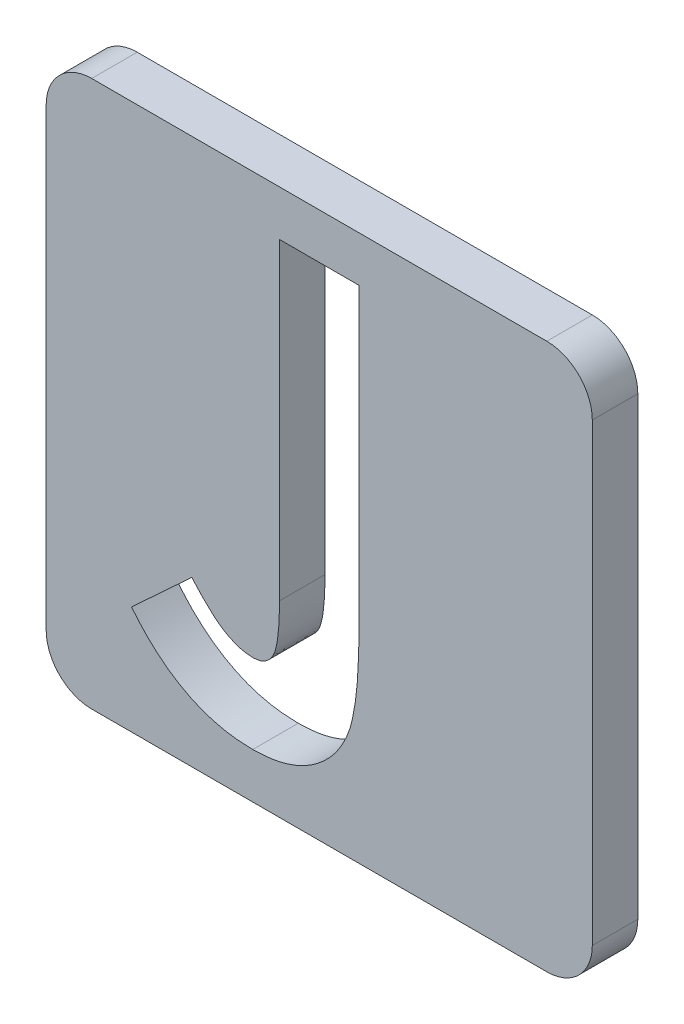
ISO-10303-21;
HEADER;
FILE_DESCRIPTION(('STEP AP214'),'2;1');
FILE_NAME('part.step','',(''),(''),'','','');
FILE_SCHEMA(('AUTOMOTIVE_DESIGN { 1 0 10303 214 1 1 1 1 }'));
ENDSEC;
DATA;
#1=APPLICATION_CONTEXT('core data for automotive mechanical design processes');
#2=APPLICATION_PROTOCOL_DEFINITION('international standard','automotive_design',2000,#1);
#3=PRODUCT_CONTEXT('',#1,'mechanical');
#4=PRODUCT('Part','Part','',(#3));
#5=PRODUCT_RELATED_PRODUCT_CATEGORY('part','',(#4));
#6=PRODUCT_DEFINITION_FORMATION('','',#4);
#7=PRODUCT_DEFINITION_CONTEXT('part definition',#1,'design');
#8=PRODUCT_DEFINITION('design','',#6,#7);
#9=PRODUCT_DEFINITION_SHAPE('','',#8);
#10=(LENGTH_UNIT() NAMED_UNIT(*) SI_UNIT(.MILLI.,.METRE.));
#11=(NAMED_UNIT(*) PLANE_ANGLE_UNIT() SI_UNIT($,.RADIAN.));
#12=(NAMED_UNIT(*) SI_UNIT($,.STERADIAN.) SOLID_ANGLE_UNIT());
#13=UNCERTAINTY_MEASURE_WITH_UNIT(LENGTH_MEASURE(1.E-05),#10,'distance_accuracy_value','');
#14=(GEOMETRIC_REPRESENTATION_CONTEXT(3) GLOBAL_UNCERTAINTY_ASSIGNED_CONTEXT((#13)) GLOBAL_UNIT_ASSIGNED_CONTEXT((#10,
#11,#12)) REPRESENTATION_CONTEXT('',''));
#15=CARTESIAN_POINT('',(0.,0.,0.));
#16=DIRECTION('',(0.,0.,1.));
#17=DIRECTION('',(1.,0.,0.));
#18=AXIS2_PLACEMENT_3D('',#15,#16,#17);
#19=CARTESIAN_POINT('',(50.,50.,10.));
#20=DIRECTION('',(0.,0.,-1.));
#21=DIRECTION('',(-1.,0.,0.));
#22=AXIS2_PLACEMENT_3D('',#19,#20,#21);
#23=PLANE('',#22);
#24=DIRECTION('',(1.,0.,0.));
#25=VECTOR('',#24,1.);
#26=CARTESIAN_POINT('',(-49.9999999999999,60.,10.));
#27=LINE('',#26,#25);
#28=CARTESIAN_POINT('',(-49.9999999999999,60.,10.));
#29=VERTEX_POINT('',#28);
#30=CARTESIAN_POINT('',(49.9999999999999,60.,10.));
#31=VERTEX_POINT('',#30);
#32=EDGE_CURVE('E267',#29,#31,#27,.T.);
#33=ORIENTED_EDGE('',*,*,#32,.F.);
#34=CARTESIAN_POINT('',(-50.,50.,10.));
#35=DIRECTION('',(0.,0.,1.));
#36=DIRECTION('',(1.,0.,0.));
#37=AXIS2_PLACEMENT_3D('',#34,#35,#36);
#38=CIRCLE('',#37,10.);
#39=CARTESIAN_POINT('',(-60.,49.9999999999999,10.));
#40=VERTEX_POINT('',#39);
#41=EDGE_CURVE('E254',#29,#40,#38,.T.);
#42=ORIENTED_EDGE('',*,*,#41,.T.);
#43=DIRECTION('',(0.,-1.,0.));
#44=VECTOR('',#43,1.);
#45=CARTESIAN_POINT('',(-60.,49.9999999999999,10.));
#46=LINE('',#45,#44);
#47=CARTESIAN_POINT('',(-60.,-49.9999999999999,10.));
#48=VERTEX_POINT('',#47);
#49=EDGE_CURVE('E282',#40,#48,#46,.T.);
#50=ORIENTED_EDGE('',*,*,#49,.T.);
#51=CARTESIAN_POINT('',(-50.,-50.,10.));
#52=DIRECTION('',(0.,0.,1.));
#53=DIRECTION('',(1.,0.,0.));
#54=AXIS2_PLACEMENT_3D('',#51,#52,#53);
#55=CIRCLE('',#54,10.);
#56=CARTESIAN_POINT('',(-49.9999999999999,-60.,10.));
#57=VERTEX_POINT('',#56);
#58=EDGE_CURVE('E286',#48,#57,#55,.T.);
#59=ORIENTED_EDGE('',*,*,#58,.T.);
#60=DIRECTION('',(1.,0.,0.));
#61=VECTOR('',#60,1.);
#62=CARTESIAN_POINT('',(-49.9999999999999,-60.,10.));
#63=LINE('',#62,#61);
#64=CARTESIAN_POINT('',(49.9999999999999,-60.,10.));
#65=VERTEX_POINT('',#64);
#66=EDGE_CURVE('E289',#57,#65,#63,.T.);
#67=ORIENTED_EDGE('',*,*,#66,.T.);
#68=CARTESIAN_POINT('',(50.,-50.,10.));
#69=DIRECTION('',(0.,0.,1.));
#70=DIRECTION('',(1.,0.,0.));
#71=AXIS2_PLACEMENT_3D('',#68,#69,#70);
#72=CIRCLE('',#71,10.);
#73=CARTESIAN_POINT('',(60.,-50.,10.));
#74=VERTEX_POINT('',#73);
#75=EDGE_CURVE('E293',#65,#74,#72,.T.);
#76=ORIENTED_EDGE('',*,*,#75,.T.);
#77=DIRECTION('',(0.,-1.,0.));
#78=VECTOR('',#77,1.);
#79=CARTESIAN_POINT('',(60.,49.9999999999999,10.));
#80=LINE('',#79,#78);
#81=CARTESIAN_POINT('',(60.,49.9999999999999,10.));
#82=VERTEX_POINT('',#81);
#83=EDGE_CURVE('E295',#82,#74,#80,.T.);
#84=ORIENTED_EDGE('',*,*,#83,.F.);
#85=CARTESIAN_POINT('',(50.,50.,10.));
#86=DIRECTION('',(0.,0.,-1.));
#87=DIRECTION('',(-1.,0.,0.));
#88=AXIS2_PLACEMENT_3D('',#85,#86,#87);
#89=CIRCLE('',#88,10.);
#90=EDGE_CURVE('E298',#31,#82,#89,.T.);
#91=ORIENTED_EDGE('',*,*,#90,.F.);
#92=EDGE_LOOP('',(#33,#42,#50,#59,#67,#76,#84,#91));
#93=FACE_BOUND('',#92,.T.);
#94=DIRECTION('',(0.,1.,0.));
#95=VECTOR('',#94,1.);
#96=CARTESIAN_POINT('',(-8.75,-18.7890625,10.));
#97=LINE('',#96,#95);
#98=CARTESIAN_POINT('',(-8.75,-18.7890625,10.));
#99=VERTEX_POINT('',#98);
#100=CARTESIAN_POINT('',(-8.75,50.,10.));
#101=VERTEX_POINT('',#100);
#102=EDGE_CURVE('E50',#99,#101,#97,.T.);
#103=ORIENTED_EDGE('',*,*,#102,.T.);
#104=DIRECTION('',(1.,0.,0.));
#105=VECTOR('',#104,1.);
#106=CARTESIAN_POINT('',(-8.75,50.,10.));
#107=LINE('',#106,#105);
#108=CARTESIAN_POINT('',(8.75,50.,10.));
#109=VERTEX_POINT('',#108);
#110=EDGE_CURVE('E162',#101,#109,#107,.T.);
#111=ORIENTED_EDGE('',*,*,#110,.T.);
#112=DIRECTION('',(0.,-1.,0.));
#113=VECTOR('',#112,1.);
#114=CARTESIAN_POINT('',(8.75,50.,10.));
#115=LINE('',#114,#113);
#116=CARTESIAN_POINT('',(8.75,-14.7265625,10.));
#117=VERTEX_POINT('',#116);
#118=EDGE_CURVE('E344',#109,#117,#115,.T.);
#119=ORIENTED_EDGE('',*,*,#118,.T.);
#120=CARTESIAN_POINT('',(8.75,-14.7265625,10.));
#121=CARTESIAN_POINT('',(8.74358397477013,-15.9636621494107,10.));
#122=CARTESIAN_POINT('',(8.73122156089561,-18.347308927923,10.));
#123=CARTESIAN_POINT('',(8.60745186955848,-21.7788803857544,10.));
#124=CARTESIAN_POINT('',(8.44009342151562,-24.9251192817215,10.));
#125=CARTESIAN_POINT('',(8.19908110918843,-27.7809843248954,10.));
#126=CARTESIAN_POINT('',(7.8411118384812,-30.346337413872,10.));
#127=CARTESIAN_POINT('',(7.43599931637115,-32.6275788685781,10.));
#128=CARTESIAN_POINT('',(6.98904775340342,-34.6340041108708,10.));
#129=CARTESIAN_POINT('',(6.23403688986838,-36.8795061070048,10.));
#130=CARTESIAN_POINT('',(5.06190440351795,-39.3661441368278,10.));
#131=CARTESIAN_POINT('',(3.29312302339564,-42.0520665799957,10.));
#132=CARTESIAN_POINT('',(1.09042405424103,-44.3856755015924,10.));
#133=CARTESIAN_POINT('',(-1.44635757385313,-46.4126845783194,10.));
#134=CARTESIAN_POINT('',(-4.33859612365525,-48.0176923341542,10.));
#135=CARTESIAN_POINT('',(-7.51966121989016,-49.1777962372361,10.));
#136=CARTESIAN_POINT('',(-10.9793837546611,-49.8708503443223,10.));
#137=CARTESIAN_POINT('',(-13.3756766533103,-49.9561068592411,10.));
#138=CARTESIAN_POINT('',(-14.609375,-50.,10.));
#139=B_SPLINE_CURVE_WITH_KNOTS('',3,(#120,#121,#122,#123,#124,#125,#126,#127,#128,#129,#130,
#131,#132,#133,#134,#135,#136,#137,#138),.UNSPECIFIED.,.F.,.F.,(4,1,1,1,1,1,1,1,1,1,1,1,1,1,1,1,
4),(0.,0.0764053506058013,0.147218025580542,0.212058993569066,0.270999490309765,
0.324170992612471,0.371969814615872,0.414105230295775,0.450981256131895,0.518077209357026,
0.583319665547195,0.64875638268336,0.715449883456707,0.783134877260214,0.852084921522458,
0.923847962045423,1.),.UNSPECIFIED.);
#140=CARTESIAN_POINT('',(-14.609375,-50.,10.));
#141=VERTEX_POINT('',#140);
#142=EDGE_CURVE('E336',#117,#141,#139,.T.);
#143=ORIENTED_EDGE('',*,*,#142,.T.);
#144=CARTESIAN_POINT('',(-14.609375,-50.,10.));
#145=CARTESIAN_POINT('',(-15.8947764125258,-49.9602054508401,10.));
#146=CARTESIAN_POINT('',(-18.4300899461713,-49.8817150601596,10.));
#147=CARTESIAN_POINT('',(-22.1483883488443,-49.2131784996106,10.));
#148=CARTESIAN_POINT('',(-25.7221379227649,-48.1413132351529,10.));
#149=CARTESIAN_POINT('',(-29.1328499701738,-46.5915247062839,9.99999999999999));
#150=CARTESIAN_POINT('',(-32.4272522812713,-44.6502051790615,10.));
#151=CARTESIAN_POINT('',(-35.5455544736893,-42.2421872629834,10.));
#152=CARTESIAN_POINT('',(-38.5528624147778,-39.4421541552723,10.));
#153=CARTESIAN_POINT('',(-40.3356129197375,-37.2934790185742,10.));
#154=CARTESIAN_POINT('',(-41.25,-36.19140625,10.));
#155=B_SPLINE_CURVE_WITH_KNOTS('',3,(#144,#145,#146,#147,#148,#149,#150,#151,#152,#153,#154),
.UNSPECIFIED.,.F.,.F.,(4,1,1,1,1,1,1,1,4),(0.,0.123873098257655,0.24432612210228,
0.363091916241499,0.482806410598963,0.604690738529227,0.731012015230361,0.862033897993613,1.),.UNSPECIFIED.);
#156=CARTESIAN_POINT('',(-41.25,-36.19140625,10.));
#157=VERTEX_POINT('',#156);
#158=EDGE_CURVE('E331',#141,#157,#155,.T.);
#159=ORIENTED_EDGE('',*,*,#158,.T.);
#160=DIRECTION('',(0.734180402826145,0.678954443321523,0.));
#161=VECTOR('',#160,1.);
#162=CARTESIAN_POINT('',(-41.25,-36.19140625,10.));
#163=LINE('',#162,#161);
#164=CARTESIAN_POINT('',(-28.0078125,-23.9453125,10.));
#165=VERTEX_POINT('',#164);
#166=EDGE_CURVE('E325',#157,#165,#163,.T.);
#167=ORIENTED_EDGE('',*,*,#166,.T.);
#168=CARTESIAN_POINT('',(-28.0078125,-23.9453125,10.));
#169=CARTESIAN_POINT('',(-27.3144665086936,-24.7292910121457,10.));
#170=CARTESIAN_POINT('',(-26.0170297603917,-26.1963255725107,10.));
#171=CARTESIAN_POINT('',(-24.0618308294355,-28.1093746690527,10.));
#172=CARTESIAN_POINT('',(-22.2981360412439,-29.646288809913,10.));
#173=CARTESIAN_POINT('',(-20.635555644691,-30.7548788195105,10.));
#174=CARTESIAN_POINT('',(-19.0666184095416,-31.5363110197004,10.));
#175=CARTESIAN_POINT('',(-17.5575675515649,-32.0991986034415,10.));
#176=CARTESIAN_POINT('',(-16.0613637854838,-32.4178249420816,10.));
#177=CARTESIAN_POINT('',(-15.0729259559888,-32.4730229237121,10.));
#178=CARTESIAN_POINT('',(-14.58984375,-32.5,10.));
#179=B_SPLINE_CURVE_WITH_KNOTS('',3,(#168,#169,#170,#171,#172,#173,#174,#175,#176,#177,#178),
.UNSPECIFIED.,.F.,.F.,(4,1,1,1,1,1,1,1,4),(0.,0.191188734676117,0.357765521601646,
0.499586074062438,0.618044672839495,0.721795541859932,0.819272160926337,0.911672337320496,1.),.UNSPECIFIED.);
#180=CARTESIAN_POINT('',(-14.58984375,-32.5,10.));
#181=VERTEX_POINT('',#180);
#182=EDGE_CURVE('E317',#165,#181,#179,.T.);
#183=ORIENTED_EDGE('',*,*,#182,.T.);
#184=CARTESIAN_POINT('',(-14.58984375,-32.5,10.));
#185=CARTESIAN_POINT('',(-14.1222739453944,-32.4756169876666,10.));
#186=CARTESIAN_POINT('',(-13.2232909253375,-32.4287364708976,10.));
#187=CARTESIAN_POINT('',(-11.9871547973749,-31.9076001044048,10.));
#188=CARTESIAN_POINT('',(-10.9450124922237,-31.0893940979087,10.));
#189=CARTESIAN_POINT('',(-10.2589275099877,-30.1487601225782,10.));
#190=CARTESIAN_POINT('',(-9.8217098019674,-29.1871789648928,10.));
#191=CARTESIAN_POINT('',(-9.54852793709075,-28.2576629543554,10.));
#192=CARTESIAN_POINT('',(-9.28927787470028,-27.1434251852839,10.));
#193=CARTESIAN_POINT('',(-9.0815725063976,-25.845024103373,10.));
#194=CARTESIAN_POINT('',(-8.92462995686318,-24.3455238406369,10.));
#195=CARTESIAN_POINT('',(-8.84640544238334,-22.6631282478337,10.));
#196=CARTESIAN_POINT('',(-8.75127439924185,-20.7887459200542,10.));
#197=CARTESIAN_POINT('',(-8.75043990603434,-19.4793271944154,10.));
#198=CARTESIAN_POINT('',(-8.75,-18.7890625,10.));
#199=B_SPLINE_CURVE_WITH_KNOTS('',3,(#184,#185,#186,#187,#188,#189,#190,#191,#192,#193,#194,
#195,#196,#197,#198),.UNSPECIFIED.,.F.,.F.,(4,1,1,1,1,1,1,1,1,1,1,1,4),(0.,0.0836606106248747,
0.160851850693831,0.236744462245999,0.319647798711959,0.367325512256431,0.426209548529817,
0.493524089529688,0.573025277738409,0.662506020502811,0.764543201859919,0.875878119325884,1.),.UNSPECIFIED.);
#200=EDGE_CURVE('E156',#181,#99,#199,.T.);
#201=ORIENTED_EDGE('',*,*,#200,.T.);
#202=EDGE_LOOP('',(#103,#111,#119,#143,#159,#167,#183,#201));
#203=FACE_BOUND('',#202,.T.);
#204=ADVANCED_FACE('F33',(#93,#203),#23,.F.);
#205=CARTESIAN_POINT('',(50.,50.,0.));
#206=DIRECTION('',(0.,0.,-1.));
#207=DIRECTION('',(-1.,0.,0.));
#208=AXIS2_PLACEMENT_3D('',#205,#206,#207);
#209=PLANE('',#208);
#210=DIRECTION('',(1.,0.,0.));
#211=VECTOR('',#210,1.);
#212=CARTESIAN_POINT('',(-49.9999999999999,60.,0.));
#213=LINE('',#212,#211);
#214=CARTESIAN_POINT('',(-49.9999999999999,60.,0.));
#215=VERTEX_POINT('',#214);
#216=CARTESIAN_POINT('',(49.9999999999999,60.,0.));
#217=VERTEX_POINT('',#216);
#218=EDGE_CURVE('E163',#215,#217,#213,.T.);
#219=ORIENTED_EDGE('',*,*,#218,.T.);
#220=CARTESIAN_POINT('',(50.,50.,0.));
#221=DIRECTION('',(0.,0.,-1.));
#222=DIRECTION('',(-1.,0.,0.));
#223=AXIS2_PLACEMENT_3D('',#220,#221,#222);
#224=CIRCLE('',#223,10.);
#225=CARTESIAN_POINT('',(60.,49.9999999999999,0.));
#226=VERTEX_POINT('',#225);
#227=EDGE_CURVE('E238',#217,#226,#224,.T.);
#228=ORIENTED_EDGE('',*,*,#227,.T.);
#229=DIRECTION('',(0.,-1.,0.));
#230=VECTOR('',#229,1.);
#231=CARTESIAN_POINT('',(60.,49.9999999999999,0.));
#232=LINE('',#231,#230);
#233=CARTESIAN_POINT('',(60.,-50.,0.));
#234=VERTEX_POINT('',#233);
#235=EDGE_CURVE('E245',#226,#234,#232,.T.);
#236=ORIENTED_EDGE('',*,*,#235,.T.);
#237=CARTESIAN_POINT('',(50.,-50.,0.));
#238=DIRECTION('',(0.,0.,1.));
#239=DIRECTION('',(1.,0.,0.));
#240=AXIS2_PLACEMENT_3D('',#237,#238,#239);
#241=CIRCLE('',#240,10.);
#242=CARTESIAN_POINT('',(49.9999999999999,-60.,0.));
#243=VERTEX_POINT('',#242);
#244=EDGE_CURVE('E258',#243,#234,#241,.T.);
#245=ORIENTED_EDGE('',*,*,#244,.F.);
#246=DIRECTION('',(1.,0.,0.));
#247=VECTOR('',#246,1.);
#248=CARTESIAN_POINT('',(-49.9999999999999,-60.,0.));
#249=LINE('',#248,#247);
#250=CARTESIAN_POINT('',(-49.9999999999999,-60.,0.));
#251=VERTEX_POINT('',#250);
#252=EDGE_CURVE('E261',#251,#243,#249,.T.);
#253=ORIENTED_EDGE('',*,*,#252,.F.);
#254=CARTESIAN_POINT('',(-50.,-50.,0.));
#255=DIRECTION('',(0.,0.,1.));
#256=DIRECTION('',(1.,0.,0.));
#257=AXIS2_PLACEMENT_3D('',#254,#255,#256);
#258=CIRCLE('',#257,10.);
#259=CARTESIAN_POINT('',(-60.,-49.9999999999999,0.));
#260=VERTEX_POINT('',#259);
#261=EDGE_CURVE('E263',#260,#251,#258,.T.);
#262=ORIENTED_EDGE('',*,*,#261,.F.);
#263=DIRECTION('',(0.,-1.,0.));
#264=VECTOR('',#263,1.);
#265=CARTESIAN_POINT('',(-60.,49.9999999999999,0.));
#266=LINE('',#265,#264);
#267=CARTESIAN_POINT('',(-60.,49.9999999999999,0.));
#268=VERTEX_POINT('',#267);
#269=EDGE_CURVE('E265',#268,#260,#266,.T.);
#270=ORIENTED_EDGE('',*,*,#269,.F.);
#271=CARTESIAN_POINT('',(-50.,50.,0.));
#272=DIRECTION('',(0.,0.,1.));
#273=DIRECTION('',(1.,0.,0.));
#274=AXIS2_PLACEMENT_3D('',#271,#272,#273);
#275=CIRCLE('',#274,10.);
#276=EDGE_CURVE('E250',#215,#268,#275,.T.);
#277=ORIENTED_EDGE('',*,*,#276,.F.);
#278=EDGE_LOOP('',(#219,#228,#236,#245,#253,#262,#270,#277));
#279=FACE_BOUND('',#278,.T.);
#280=DIRECTION('',(1.,0.,0.));
#281=VECTOR('',#280,1.);
#282=CARTESIAN_POINT('',(-8.75,50.,0.));
#283=LINE('',#282,#281);
#284=CARTESIAN_POINT('',(-8.75,50.,0.));
#285=VERTEX_POINT('',#284);
#286=CARTESIAN_POINT('',(8.75,50.,0.));
#287=VERTEX_POINT('',#286);
#288=EDGE_CURVE('E155',#285,#287,#283,.T.);
#289=ORIENTED_EDGE('',*,*,#288,.F.);
#290=DIRECTION('',(0.,1.,0.));
#291=VECTOR('',#290,1.);
#292=CARTESIAN_POINT('',(-8.75,-18.7890625,0.));
#293=LINE('',#292,#291);
#294=CARTESIAN_POINT('',(-8.75,-18.7890625,0.));
#295=VERTEX_POINT('',#294);
#296=EDGE_CURVE('E147',#295,#285,#293,.T.);
#297=ORIENTED_EDGE('',*,*,#296,.F.);
#298=CARTESIAN_POINT('',(-14.58984375,-32.5,0.));
#299=CARTESIAN_POINT('',(-14.1222739453944,-32.4756169876666,0.));
#300=CARTESIAN_POINT('',(-13.2232909253375,-32.4287364708976,0.));
#301=CARTESIAN_POINT('',(-11.9871547973749,-31.9076001044048,0.));
#302=CARTESIAN_POINT('',(-10.9450124922237,-31.0893940979087,0.));
#303=CARTESIAN_POINT('',(-10.2589275099877,-30.1487601225782,0.));
#304=CARTESIAN_POINT('',(-9.8217098019674,-29.1871789648928,0.));
#305=CARTESIAN_POINT('',(-9.54852793709075,-28.2576629543554,0.));
#306=CARTESIAN_POINT('',(-9.28927787470028,-27.1434251852839,0.));
#307=CARTESIAN_POINT('',(-9.0815725063976,-25.845024103373,0.));
#308=CARTESIAN_POINT('',(-8.92462995686318,-24.3455238406369,0.));
#309=CARTESIAN_POINT('',(-8.84640544238334,-22.6631282478337,0.));
#310=CARTESIAN_POINT('',(-8.75127439924185,-20.7887459200542,0.));
#311=CARTESIAN_POINT('',(-8.75043990603434,-19.4793271944154,0.));
#312=CARTESIAN_POINT('',(-8.75,-18.7890625,0.));
#313=B_SPLINE_CURVE_WITH_KNOTS('',3,(#298,#299,#300,#301,#302,#303,#304,#305,#306,#307,#308,
#309,#310,#311,#312),.UNSPECIFIED.,.F.,.F.,(4,1,1,1,1,1,1,1,1,1,1,1,4),(0.,0.0836606106248747,
0.160851850693831,0.236744462245999,0.319647798711959,0.367325512256431,0.426209548529817,
0.493524089529688,0.573025277738409,0.662506020502811,0.764543201859919,0.875878119325884,1.),.UNSPECIFIED.);
#314=CARTESIAN_POINT('',(-14.58984375,-32.5,0.));
#315=VERTEX_POINT('',#314);
#316=EDGE_CURVE('E312',#315,#295,#313,.T.);
#317=ORIENTED_EDGE('',*,*,#316,.F.);
#318=CARTESIAN_POINT('',(-28.0078125,-23.9453125,0.));
#319=CARTESIAN_POINT('',(-27.3144665086936,-24.7292910121457,0.));
#320=CARTESIAN_POINT('',(-26.0170297603917,-26.1963255725107,0.));
#321=CARTESIAN_POINT('',(-24.0618308294355,-28.1093746690527,0.));
#322=CARTESIAN_POINT('',(-22.2981360412439,-29.646288809913,0.));
#323=CARTESIAN_POINT('',(-20.635555644691,-30.7548788195105,0.));
#324=CARTESIAN_POINT('',(-19.0666184095416,-31.5363110197004,0.));
#325=CARTESIAN_POINT('',(-17.5575675515649,-32.0991986034415,0.));
#326=CARTESIAN_POINT('',(-16.0613637854838,-32.4178249420816,0.));
#327=CARTESIAN_POINT('',(-15.0729259559888,-32.4730229237121,0.));
#328=CARTESIAN_POINT('',(-14.58984375,-32.5,0.));
#329=B_SPLINE_CURVE_WITH_KNOTS('',3,(#318,#319,#320,#321,#322,#323,#324,#325,#326,#327,#328),
.UNSPECIFIED.,.F.,.F.,(4,1,1,1,1,1,1,1,4),(0.,0.191188734676117,0.357765521601646,
0.499586074062438,0.618044672839495,0.721795541859932,0.819272160926337,0.911672337320496,1.),.UNSPECIFIED.);
#330=CARTESIAN_POINT('',(-28.0078125,-23.9453125,0.));
#331=VERTEX_POINT('',#330);
#332=EDGE_CURVE('E356',#331,#315,#329,.T.);
#333=ORIENTED_EDGE('',*,*,#332,.F.);
#334=DIRECTION('',(0.734180402826145,0.678954443321523,0.));
#335=VECTOR('',#334,1.);
#336=CARTESIAN_POINT('',(-41.25,-36.19140625,0.));
#337=LINE('',#336,#335);
#338=CARTESIAN_POINT('',(-41.25,-36.19140625,0.));
#339=VERTEX_POINT('',#338);
#340=EDGE_CURVE('E387',#339,#331,#337,.T.);
#341=ORIENTED_EDGE('',*,*,#340,.F.);
#342=CARTESIAN_POINT('',(-14.609375,-50.,0.));
#343=CARTESIAN_POINT('',(-15.8947764125258,-49.9602054508401,0.));
#344=CARTESIAN_POINT('',(-18.4300899461713,-49.8817150601596,0.));
#345=CARTESIAN_POINT('',(-22.1483883488443,-49.2131784996106,0.));
#346=CARTESIAN_POINT('',(-25.7221379227649,-48.1413132351529,0.));
#347=CARTESIAN_POINT('',(-29.1328499701738,-46.5915247062839,0.));
#348=CARTESIAN_POINT('',(-32.4272522812713,-44.6502051790615,0.));
#349=CARTESIAN_POINT('',(-35.5455544736893,-42.2421872629834,0.));
#350=CARTESIAN_POINT('',(-38.5528624147778,-39.4421541552723,0.));
#351=CARTESIAN_POINT('',(-40.3356129197375,-37.2934790185742,0.));
#352=CARTESIAN_POINT('',(-41.25,-36.19140625,0.));
#353=B_SPLINE_CURVE_WITH_KNOTS('',3,(#342,#343,#344,#345,#346,#347,#348,#349,#350,#351,#352),
.UNSPECIFIED.,.F.,.F.,(4,1,1,1,1,1,1,1,4),(0.,0.123873098257655,0.24432612210228,
0.363091916241499,0.482806410598963,0.604690738529227,0.731012015230361,0.862033897993613,1.),.UNSPECIFIED.);
#354=CARTESIAN_POINT('',(-14.609375,-50.,0.));
#355=VERTEX_POINT('',#354);
#356=EDGE_CURVE('E178',#355,#339,#353,.T.);
#357=ORIENTED_EDGE('',*,*,#356,.F.);
#358=CARTESIAN_POINT('',(8.75,-14.7265625,0.));
#359=CARTESIAN_POINT('',(8.74358397477013,-15.9636621494107,0.));
#360=CARTESIAN_POINT('',(8.73122156089561,-18.347308927923,0.));
#361=CARTESIAN_POINT('',(8.60745186955848,-21.7788803857544,0.));
#362=CARTESIAN_POINT('',(8.44009342151562,-24.9251192817215,0.));
#363=CARTESIAN_POINT('',(8.19908110918843,-27.7809843248954,0.));
#364=CARTESIAN_POINT('',(7.8411118384812,-30.346337413872,0.));
#365=CARTESIAN_POINT('',(7.43599931637115,-32.6275788685781,0.));
#366=CARTESIAN_POINT('',(6.98904775340342,-34.6340041108708,0.));
#367=CARTESIAN_POINT('',(6.23403688986838,-36.8795061070048,0.));
#368=CARTESIAN_POINT('',(5.06190440351795,-39.3661441368278,0.));
#369=CARTESIAN_POINT('',(3.29312302339564,-42.0520665799957,0.));
#370=CARTESIAN_POINT('',(1.09042405424103,-44.3856755015924,0.));
#371=CARTESIAN_POINT('',(-1.44635757385313,-46.4126845783194,0.));
#372=CARTESIAN_POINT('',(-4.33859612365525,-48.0176923341542,0.));
#373=CARTESIAN_POINT('',(-7.51966121989016,-49.1777962372361,0.));
#374=CARTESIAN_POINT('',(-10.9793837546611,-49.8708503443223,0.));
#375=CARTESIAN_POINT('',(-13.3756766533103,-49.9561068592411,0.));
#376=CARTESIAN_POINT('',(-14.609375,-50.,0.));
#377=B_SPLINE_CURVE_WITH_KNOTS('',3,(#358,#359,#360,#361,#362,#363,#364,#365,#366,#367,#368,
#369,#370,#371,#372,#373,#374,#375,#376),.UNSPECIFIED.,.F.,.F.,(4,1,1,1,1,1,1,1,1,1,1,1,1,1,1,1,
4),(0.,0.0764053506058013,0.147218025580542,0.212058993569066,0.270999490309765,
0.324170992612471,0.371969814615872,0.414105230295775,0.450981256131895,0.518077209357026,
0.583319665547195,0.64875638268336,0.715449883456707,0.783134877260214,0.852084921522458,
0.923847962045423,1.),.UNSPECIFIED.);
#378=CARTESIAN_POINT('',(8.75,-14.7265625,0.));
#379=VERTEX_POINT('',#378);
#380=EDGE_CURVE('E171',#379,#355,#377,.T.);
#381=ORIENTED_EDGE('',*,*,#380,.F.);
#382=DIRECTION('',(0.,-1.,0.));
#383=VECTOR('',#382,1.);
#384=CARTESIAN_POINT('',(8.75,50.,0.));
#385=LINE('',#384,#383);
#386=EDGE_CURVE('E169',#287,#379,#385,.T.);
#387=ORIENTED_EDGE('',*,*,#386,.F.);
#388=EDGE_LOOP('',(#289,#297,#317,#333,#341,#357,#381,#387));
#389=FACE_BOUND('',#388,.T.);
#390=ADVANCED_FACE('F167',(#279,#389),#209,.T.);
#391=CARTESIAN_POINT('',(-49.9999999999999,60.,10.));
#392=DIRECTION('',(0.,1.,0.));
#393=DIRECTION('',(0.,0.,1.));
#394=AXIS2_PLACEMENT_3D('',#391,#392,#393);
#395=PLANE('',#394);
#396=ORIENTED_EDGE('',*,*,#218,.F.);
#397=DIRECTION('',(0.,0.,-1.));
#398=VECTOR('',#397,1.);
#399=CARTESIAN_POINT('',(-49.9999999999999,60.,10.));
#400=LINE('',#399,#398);
#401=EDGE_CURVE('E11',#29,#215,#400,.T.);
#402=ORIENTED_EDGE('',*,*,#401,.F.);
#403=ORIENTED_EDGE('',*,*,#32,.T.);
#404=DIRECTION('',(0.,0.,-1.));
#405=VECTOR('',#404,1.);
#406=CARTESIAN_POINT('',(49.9999999999999,60.,10.));
#407=LINE('',#406,#405);
#408=EDGE_CURVE('E37',#31,#217,#407,.T.);
#409=ORIENTED_EDGE('',*,*,#408,.T.);
#410=EDGE_LOOP('',(#396,#402,#403,#409));
#411=FACE_BOUND('',#410,.T.);
#412=ADVANCED_FACE('F35',(#411),#395,.T.);
#413=CARTESIAN_POINT('',(-50.,50.,10.));
#414=DIRECTION('',(0.,0.,-1.));
#415=DIRECTION('',(-1.,0.,0.));
#416=AXIS2_PLACEMENT_3D('',#413,#414,#415);
#417=CYLINDRICAL_SURFACE('',#416,10.);
#418=ORIENTED_EDGE('',*,*,#276,.T.);
#419=DIRECTION('',(0.,0.,-1.));
#420=VECTOR('',#419,1.);
#421=CARTESIAN_POINT('',(-60.,49.9999999999999,10.));
#422=LINE('',#421,#420);
#423=EDGE_CURVE('E42',#40,#268,#422,.T.);
#424=ORIENTED_EDGE('',*,*,#423,.F.);
#425=ORIENTED_EDGE('',*,*,#41,.F.);
#426=ORIENTED_EDGE('',*,*,#401,.T.);
#427=EDGE_LOOP('',(#418,#424,#425,#426));
#428=FACE_BOUND('',#427,.T.);
#429=ADVANCED_FACE('F209',(#428),#417,.T.);
#430=CARTESIAN_POINT('',(-60.,49.9999999999999,10.));
#431=DIRECTION('',(1.,0.,0.));
#432=DIRECTION('',(0.,1.,0.));
#433=AXIS2_PLACEMENT_3D('',#430,#431,#432);
#434=PLANE('',#433);
#435=ORIENTED_EDGE('',*,*,#269,.T.);
#436=DIRECTION('',(0.,0.,-1.));
#437=VECTOR('',#436,1.);
#438=CARTESIAN_POINT('',(-60.,-49.9999999999999,10.));
#439=LINE('',#438,#437);
#440=EDGE_CURVE('E271',#48,#260,#439,.T.);
#441=ORIENTED_EDGE('',*,*,#440,.F.);
#442=ORIENTED_EDGE('',*,*,#49,.F.);
#443=ORIENTED_EDGE('',*,*,#423,.T.);
#444=EDGE_LOOP('',(#435,#441,#442,#443));
#445=FACE_BOUND('',#444,.T.);
#446=ADVANCED_FACE('F212',(#445),#434,.F.);
#447=CARTESIAN_POINT('',(-50.,-50.,10.));
#448=DIRECTION('',(0.,0.,-1.));
#449=DIRECTION('',(-1.,0.,0.));
#450=AXIS2_PLACEMENT_3D('',#447,#448,#449);
#451=CYLINDRICAL_SURFACE('',#450,10.);
#452=ORIENTED_EDGE('',*,*,#261,.T.);
#453=DIRECTION('',(0.,0.,-1.));
#454=VECTOR('',#453,1.);
#455=CARTESIAN_POINT('',(-49.9999999999999,-60.,10.));
#456=LINE('',#455,#454);
#457=EDGE_CURVE('E274',#57,#251,#456,.T.);
#458=ORIENTED_EDGE('',*,*,#457,.F.);
#459=ORIENTED_EDGE('',*,*,#58,.F.);
#460=ORIENTED_EDGE('',*,*,#440,.T.);
#461=EDGE_LOOP('',(#452,#458,#459,#460));
#462=FACE_BOUND('',#461,.T.);
#463=ADVANCED_FACE('F216',(#462),#451,.T.);
#464=CARTESIAN_POINT('',(-49.9999999999999,-60.,10.));
#465=DIRECTION('',(0.,1.,0.));
#466=DIRECTION('',(0.,0.,1.));
#467=AXIS2_PLACEMENT_3D('',#464,#465,#466);
#468=PLANE('',#467);
#469=ORIENTED_EDGE('',*,*,#252,.T.);
#470=DIRECTION('',(0.,0.,-1.));
#471=VECTOR('',#470,1.);
#472=CARTESIAN_POINT('',(49.9999999999999,-60.,10.));
#473=LINE('',#472,#471);
#474=EDGE_CURVE('E277',#65,#243,#473,.T.);
#475=ORIENTED_EDGE('',*,*,#474,.F.);
#476=ORIENTED_EDGE('',*,*,#66,.F.);
#477=ORIENTED_EDGE('',*,*,#457,.T.);
#478=EDGE_LOOP('',(#469,#475,#476,#477));
#479=FACE_BOUND('',#478,.T.);
#480=ADVANCED_FACE('F220',(#479),#468,.F.);
#481=CARTESIAN_POINT('',(50.,-50.,10.));
#482=DIRECTION('',(0.,0.,-1.));
#483=DIRECTION('',(-1.,0.,0.));
#484=AXIS2_PLACEMENT_3D('',#481,#482,#483);
#485=CYLINDRICAL_SURFACE('',#484,10.);
#486=ORIENTED_EDGE('',*,*,#244,.T.);
#487=DIRECTION('',(0.,0.,-1.));
#488=VECTOR('',#487,1.);
#489=CARTESIAN_POINT('',(60.,-50.,10.));
#490=LINE('',#489,#488);
#491=EDGE_CURVE('E280',#74,#234,#490,.T.);
#492=ORIENTED_EDGE('',*,*,#491,.F.);
#493=ORIENTED_EDGE('',*,*,#75,.F.);
#494=ORIENTED_EDGE('',*,*,#474,.T.);
#495=EDGE_LOOP('',(#486,#492,#493,#494));
#496=FACE_BOUND('',#495,.T.);
#497=ADVANCED_FACE('F224',(#496),#485,.T.);
#498=CARTESIAN_POINT('',(60.,49.9999999999999,10.));
#499=DIRECTION('',(1.,0.,0.));
#500=DIRECTION('',(0.,1.,0.));
#501=AXIS2_PLACEMENT_3D('',#498,#499,#500);
#502=PLANE('',#501);
#503=ORIENTED_EDGE('',*,*,#235,.F.);
#504=DIRECTION('',(0.,0.,-1.));
#505=VECTOR('',#504,1.);
#506=CARTESIAN_POINT('',(60.,49.9999999999999,10.));
#507=LINE('',#506,#505);
#508=EDGE_CURVE('E242',#82,#226,#507,.T.);
#509=ORIENTED_EDGE('',*,*,#508,.F.);
#510=ORIENTED_EDGE('',*,*,#83,.T.);
#511=ORIENTED_EDGE('',*,*,#491,.T.);
#512=EDGE_LOOP('',(#503,#509,#510,#511));
#513=FACE_BOUND('',#512,.T.);
#514=ADVANCED_FACE('F228',(#513),#502,.T.);
#515=CARTESIAN_POINT('',(50.,50.,10.));
#516=DIRECTION('',(0.,0.,-1.));
#517=DIRECTION('',(-1.,0.,0.));
#518=AXIS2_PLACEMENT_3D('',#515,#516,#517);
#519=CYLINDRICAL_SURFACE('',#518,10.);
#520=ORIENTED_EDGE('',*,*,#227,.F.);
#521=ORIENTED_EDGE('',*,*,#408,.F.);
#522=ORIENTED_EDGE('',*,*,#90,.T.);
#523=ORIENTED_EDGE('',*,*,#508,.T.);
#524=EDGE_LOOP('',(#520,#521,#522,#523));
#525=FACE_BOUND('',#524,.T.);
#526=ADVANCED_FACE('F202',(#525),#519,.T.);
#527=CARTESIAN_POINT('',(-8.75,-18.7890625,0.));
#528=DIRECTION('',(1.,0.,0.));
#529=DIRECTION('',(0.,0.,-1.));
#530=AXIS2_PLACEMENT_3D('',#527,#528,#529);
#531=PLANE('',#530);
#532=ORIENTED_EDGE('',*,*,#102,.F.);
#533=DIRECTION('',(0.,0.,1.));
#534=VECTOR('',#533,1.);
#535=CARTESIAN_POINT('',(-8.75,-18.7890625,0.));
#536=LINE('',#535,#534);
#537=EDGE_CURVE('E151',#295,#99,#536,.T.);
#538=ORIENTED_EDGE('',*,*,#537,.F.);
#539=ORIENTED_EDGE('',*,*,#296,.T.);
#540=DIRECTION('',(0.,0.,1.));
#541=VECTOR('',#540,1.);
#542=CARTESIAN_POINT('',(-8.75,50.,0.));
#543=LINE('',#542,#541);
#544=EDGE_CURVE('E150',#285,#101,#543,.T.);
#545=ORIENTED_EDGE('',*,*,#544,.T.);
#546=EDGE_LOOP('',(#532,#538,#539,#545));
#547=FACE_BOUND('',#546,.T.);
#548=ADVANCED_FACE('F149',(#547),#531,.T.);
#549=CARTESIAN_POINT('',(-8.75,50.,0.));
#550=DIRECTION('',(0.,-1.,0.));
#551=DIRECTION('',(0.,0.,-1.));
#552=AXIS2_PLACEMENT_3D('',#549,#550,#551);
#553=PLANE('',#552);
#554=ORIENTED_EDGE('',*,*,#110,.F.);
#555=ORIENTED_EDGE('',*,*,#544,.F.);
#556=ORIENTED_EDGE('',*,*,#288,.T.);
#557=DIRECTION('',(0.,0.,1.));
#558=VECTOR('',#557,1.);
#559=CARTESIAN_POINT('',(8.75,50.,0.));
#560=LINE('',#559,#558);
#561=EDGE_CURVE('E164',#287,#109,#560,.T.);
#562=ORIENTED_EDGE('',*,*,#561,.T.);
#563=EDGE_LOOP('',(#554,#555,#556,#562));
#564=FACE_BOUND('',#563,.T.);
#565=ADVANCED_FACE('F159',(#564),#553,.T.);
#566=CARTESIAN_POINT('',(8.75,50.,0.));
#567=DIRECTION('',(-1.,0.,0.));
#568=DIRECTION('',(0.,0.,1.));
#569=AXIS2_PLACEMENT_3D('',#566,#567,#568);
#570=PLANE('',#569);
#571=ORIENTED_EDGE('',*,*,#118,.F.);
#572=ORIENTED_EDGE('',*,*,#561,.F.);
#573=ORIENTED_EDGE('',*,*,#386,.T.);
#574=DIRECTION('',(0.,0.,1.));
#575=VECTOR('',#574,1.);
#576=CARTESIAN_POINT('',(8.75,-14.7265625,0.));
#577=LINE('',#576,#575);
#578=EDGE_CURVE('E302',#379,#117,#577,.T.);
#579=ORIENTED_EDGE('',*,*,#578,.T.);
#580=EDGE_LOOP('',(#571,#572,#573,#579));
#581=FACE_BOUND('',#580,.T.);
#582=ADVANCED_FACE('F192',(#581),#570,.T.);
#583=DIRECTION('',(0.,0.,1.));
#584=VECTOR('',#583,1.);
#585=SURFACE_OF_LINEAR_EXTRUSION('',#377,#584);
#586=ORIENTED_EDGE('',*,*,#142,.F.);
#587=ORIENTED_EDGE('',*,*,#578,.F.);
#588=ORIENTED_EDGE('',*,*,#380,.T.);
#589=DIRECTION('',(0.,0.,1.));
#590=VECTOR('',#589,1.);
#591=CARTESIAN_POINT('',(-14.609375,-50.,0.));
#592=LINE('',#591,#590);
#593=EDGE_CURVE('E304',#355,#141,#592,.T.);
#594=ORIENTED_EDGE('',*,*,#593,.T.);
#595=EDGE_LOOP('',(#586,#587,#588,#594));
#596=FACE_BOUND('',#595,.T.);
#597=ADVANCED_FACE('F187',(#596),#585,.T.);
#598=DIRECTION('',(0.,0.,1.));
#599=VECTOR('',#598,1.);
#600=SURFACE_OF_LINEAR_EXTRUSION('',#353,#599);
#601=ORIENTED_EDGE('',*,*,#158,.F.);
#602=ORIENTED_EDGE('',*,*,#593,.F.);
#603=ORIENTED_EDGE('',*,*,#356,.T.);
#604=DIRECTION('',(0.,0.,1.));
#605=VECTOR('',#604,1.);
#606=CARTESIAN_POINT('',(-41.25,-36.19140625,0.));
#607=LINE('',#606,#605);
#608=EDGE_CURVE('E306',#339,#157,#607,.T.);
#609=ORIENTED_EDGE('',*,*,#608,.T.);
#610=EDGE_LOOP('',(#601,#602,#603,#609));
#611=FACE_BOUND('',#610,.T.);
#612=ADVANCED_FACE('F191',(#611),#600,.T.);
#613=CARTESIAN_POINT('',(-41.25,-36.19140625,0.));
#614=DIRECTION('',(0.678954443321523,-0.734180402826145,0.));
#615=DIRECTION('',(0.734180402826145,0.678954443321523,0.));
#616=AXIS2_PLACEMENT_3D('',#613,#614,#615);
#617=PLANE('',#616);
#618=ORIENTED_EDGE('',*,*,#166,.F.);
#619=ORIENTED_EDGE('',*,*,#608,.F.);
#620=ORIENTED_EDGE('',*,*,#340,.T.);
#621=DIRECTION('',(0.,0.,1.));
#622=VECTOR('',#621,1.);
#623=CARTESIAN_POINT('',(-28.0078125,-23.9453125,0.));
#624=LINE('',#623,#622);
#625=EDGE_CURVE('E308',#331,#165,#624,.T.);
#626=ORIENTED_EDGE('',*,*,#625,.T.);
#627=EDGE_LOOP('',(#618,#619,#620,#626));
#628=FACE_BOUND('',#627,.T.);
#629=ADVANCED_FACE('F369',(#628),#617,.T.);
#630=DIRECTION('',(0.,0.,1.));
#631=VECTOR('',#630,1.);
#632=SURFACE_OF_LINEAR_EXTRUSION('',#329,#631);
#633=ORIENTED_EDGE('',*,*,#182,.F.);
#634=ORIENTED_EDGE('',*,*,#625,.F.);
#635=ORIENTED_EDGE('',*,*,#332,.T.);
#636=DIRECTION('',(0.,0.,1.));
#637=VECTOR('',#636,1.);
#638=CARTESIAN_POINT('',(-14.58984375,-32.5,0.));
#639=LINE('',#638,#637);
#640=EDGE_CURVE('E58',#315,#181,#639,.T.);
#641=ORIENTED_EDGE('',*,*,#640,.T.);
#642=EDGE_LOOP('',(#633,#634,#635,#641));
#643=FACE_BOUND('',#642,.T.);
#644=ADVANCED_FACE('F367',(#643),#632,.T.);
#645=DIRECTION('',(0.,0.,1.));
#646=VECTOR('',#645,1.);
#647=SURFACE_OF_LINEAR_EXTRUSION('',#313,#646);
#648=ORIENTED_EDGE('',*,*,#200,.F.);
#649=ORIENTED_EDGE('',*,*,#640,.F.);
#650=ORIENTED_EDGE('',*,*,#316,.T.);
#651=ORIENTED_EDGE('',*,*,#537,.T.);
#652=EDGE_LOOP('',(#648,#649,#650,#651));
#653=FACE_BOUND('',#652,.T.);
#654=ADVANCED_FACE('F364',(#653),#647,.T.);
#655=CLOSED_SHELL('',(#204,#390,#412,#429,#446,#463,#480,#497,#514,#526,#548,#565,#582,#597,
#612,#629,#644,#654));
#656=MANIFOLD_SOLID_BREP('B2',#655);
#657=ADVANCED_BREP_SHAPE_REPRESENTATION('',(#18,#656),#14);
#658=SHAPE_DEFINITION_REPRESENTATION(#9,#657);
ENDSEC;
END-ISO-10303-21;
